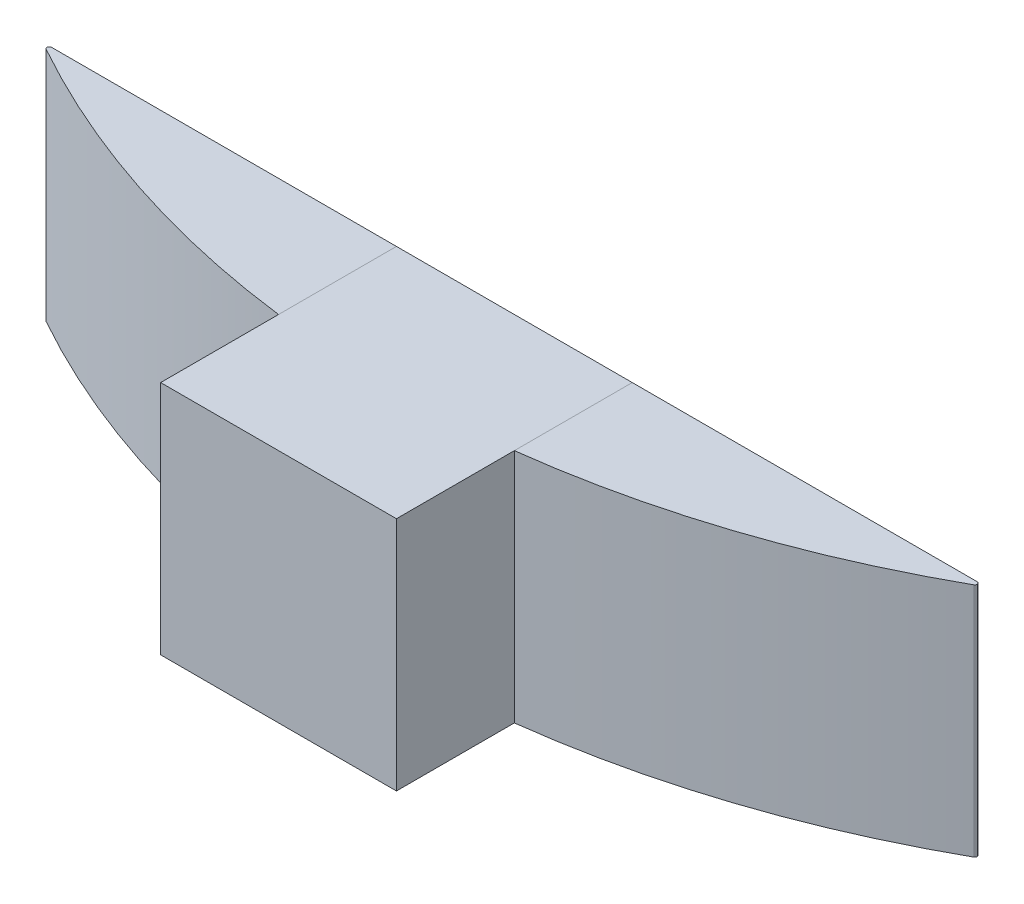
ISO-10303-21;
HEADER;
FILE_DESCRIPTION(('STEP AP214'),'2;1');
FILE_NAME('part.step','',(''),(''),'','','');
FILE_SCHEMA(('AUTOMOTIVE_DESIGN { 1 0 10303 214 1 1 1 1 }'));
ENDSEC;
DATA;
#1=APPLICATION_CONTEXT('core data for automotive mechanical design processes');
#2=APPLICATION_PROTOCOL_DEFINITION('international standard','automotive_design',2000,#1);
#3=PRODUCT_CONTEXT('',#1,'mechanical');
#4=PRODUCT('Part','Part','',(#3));
#5=PRODUCT_RELATED_PRODUCT_CATEGORY('part','',(#4));
#6=PRODUCT_DEFINITION_FORMATION('','',#4);
#7=PRODUCT_DEFINITION_CONTEXT('part definition',#1,'design');
#8=PRODUCT_DEFINITION('design','',#6,#7);
#9=PRODUCT_DEFINITION_SHAPE('','',#8);
#10=(LENGTH_UNIT() NAMED_UNIT(*) SI_UNIT(.MILLI.,.METRE.));
#11=(NAMED_UNIT(*) PLANE_ANGLE_UNIT() SI_UNIT($,.RADIAN.));
#12=(NAMED_UNIT(*) SI_UNIT($,.STERADIAN.) SOLID_ANGLE_UNIT());
#13=UNCERTAINTY_MEASURE_WITH_UNIT(LENGTH_MEASURE(1.E-05),#10,'distance_accuracy_value','');
#14=(GEOMETRIC_REPRESENTATION_CONTEXT(3) GLOBAL_UNCERTAINTY_ASSIGNED_CONTEXT((#13)) GLOBAL_UNIT_ASSIGNED_CONTEXT((#10,
#11,#12)) REPRESENTATION_CONTEXT('',''));
#15=CARTESIAN_POINT('',(0.,0.,0.));
#16=DIRECTION('',(0.,0.,1.));
#17=DIRECTION('',(1.,0.,0.));
#18=AXIS2_PLACEMENT_3D('',#15,#16,#17);
#19=CARTESIAN_POINT('',(0.,0.,0.));
#20=DIRECTION('',(0.,0.,1.));
#21=DIRECTION('',(1.,0.,0.));
#22=AXIS2_PLACEMENT_3D('',#19,#20,#21);
#23=PLANE('',#22);
#24=DIRECTION('',(1.,0.,0.));
#25=VECTOR('',#24,1.);
#26=CARTESIAN_POINT('',(-0.5,0.5,0.));
#27=LINE('',#26,#25);
#28=CARTESIAN_POINT('',(-0.5,0.5,0.));
#29=VERTEX_POINT('',#28);
#30=CARTESIAN_POINT('',(0.5,0.5,0.));
#31=VERTEX_POINT('',#30);
#32=EDGE_CURVE('P0_E20',#29,#31,#27,.T.);
#33=ORIENTED_EDGE('',*,*,#32,.T.);
#34=DIRECTION('',(0.,-1.,0.));
#35=VECTOR('',#34,1.);
#36=CARTESIAN_POINT('',(0.5,0.5,0.));
#37=LINE('',#36,#35);
#38=CARTESIAN_POINT('',(0.5,-0.5,0.));
#39=VERTEX_POINT('',#38);
#40=EDGE_CURVE('P0_E71',#31,#39,#37,.T.);
#41=ORIENTED_EDGE('',*,*,#40,.T.);
#42=DIRECTION('',(-1.,0.,0.));
#43=VECTOR('',#42,1.);
#44=CARTESIAN_POINT('',(0.5,-0.5,0.));
#45=LINE('',#44,#43);
#46=CARTESIAN_POINT('',(-0.5,-0.5,0.));
#47=VERTEX_POINT('',#46);
#48=EDGE_CURVE('P0_E99',#39,#47,#45,.T.);
#49=ORIENTED_EDGE('',*,*,#48,.T.);
#50=DIRECTION('',(0.,1.,0.));
#51=VECTOR('',#50,1.);
#52=CARTESIAN_POINT('',(-0.5,-0.5,0.));
#53=LINE('',#52,#51);
#54=EDGE_CURVE('P0_E72',#47,#29,#53,.T.);
#55=ORIENTED_EDGE('',*,*,#54,.T.);
#56=EDGE_LOOP('',(#33,#41,#49,#55));
#57=FACE_BOUND('',#56,.T.);
#58=ADVANCED_FACE('P0_F17',(#57),#23,.F.);
#59=CARTESIAN_POINT('',(0.,0.,1.));
#60=DIRECTION('',(0.,0.,1.));
#61=DIRECTION('',(1.,0.,0.));
#62=AXIS2_PLACEMENT_3D('',#59,#60,#61);
#63=PLANE('',#62);
#64=DIRECTION('',(-1.,0.,0.));
#65=VECTOR('',#64,1.);
#66=CARTESIAN_POINT('',(-0.5,0.5,1.));
#67=LINE('',#66,#65);
#68=CARTESIAN_POINT('',(0.5,0.5,1.));
#69=VERTEX_POINT('',#68);
#70=CARTESIAN_POINT('',(-0.5,0.5,1.));
#71=VERTEX_POINT('',#70);
#72=EDGE_CURVE('P0_E11',#69,#71,#67,.T.);
#73=ORIENTED_EDGE('',*,*,#72,.T.);
#74=DIRECTION('',(0.,-1.,0.));
#75=VECTOR('',#74,1.);
#76=CARTESIAN_POINT('',(-0.5,-0.5,1.));
#77=LINE('',#76,#75);
#78=CARTESIAN_POINT('',(-0.5,-0.5,1.));
#79=VERTEX_POINT('',#78);
#80=EDGE_CURVE('P0_E100',#71,#79,#77,.T.);
#81=ORIENTED_EDGE('',*,*,#80,.T.);
#82=DIRECTION('',(1.,0.,0.));
#83=VECTOR('',#82,1.);
#84=CARTESIAN_POINT('',(0.5,-0.5,1.));
#85=LINE('',#84,#83);
#86=CARTESIAN_POINT('',(0.5,-0.5,1.));
#87=VERTEX_POINT('',#86);
#88=EDGE_CURVE('P0_E93',#79,#87,#85,.T.);
#89=ORIENTED_EDGE('',*,*,#88,.T.);
#90=DIRECTION('',(0.,1.,0.));
#91=VECTOR('',#90,1.);
#92=CARTESIAN_POINT('',(0.5,0.5,1.));
#93=LINE('',#92,#91);
#94=EDGE_CURVE('P0_E81',#87,#69,#93,.T.);
#95=ORIENTED_EDGE('',*,*,#94,.T.);
#96=EDGE_LOOP('',(#73,#81,#89,#95));
#97=FACE_BOUND('',#96,.T.);
#98=ADVANCED_FACE('P0_F118',(#97),#63,.T.);
#99=CARTESIAN_POINT('',(0.5,0.5,0.));
#100=DIRECTION('',(0.,1.,0.));
#101=DIRECTION('',(1.,0.,0.));
#102=AXIS2_PLACEMENT_3D('',#99,#100,#101);
#103=PLANE('',#102);
#104=ORIENTED_EDGE('',*,*,#32,.F.);
#105=DIRECTION('',(0.,0.,1.));
#106=VECTOR('',#105,1.);
#107=CARTESIAN_POINT('',(-0.5,0.5,0.));
#108=LINE('',#107,#106);
#109=EDGE_CURVE('P0_E74',#29,#71,#108,.T.);
#110=ORIENTED_EDGE('',*,*,#109,.T.);
#111=ORIENTED_EDGE('',*,*,#72,.F.);
#112=DIRECTION('',(0.,0.,1.));
#113=VECTOR('',#112,1.);
#114=CARTESIAN_POINT('',(0.5,0.5,0.));
#115=LINE('',#114,#113);
#116=EDGE_CURVE('P0_E76',#31,#69,#115,.T.);
#117=ORIENTED_EDGE('',*,*,#116,.F.);
#118=EDGE_LOOP('',(#104,#110,#111,#117));
#119=FACE_BOUND('',#118,.T.);
#120=ADVANCED_FACE('P0_F77',(#119),#103,.T.);
#121=CARTESIAN_POINT('',(-0.5,0.5,0.));
#122=DIRECTION('',(-1.,0.,0.));
#123=DIRECTION('',(0.,0.,1.));
#124=AXIS2_PLACEMENT_3D('',#121,#122,#123);
#125=PLANE('',#124);
#126=ORIENTED_EDGE('',*,*,#54,.F.);
#127=DIRECTION('',(0.,0.,1.));
#128=VECTOR('',#127,1.);
#129=CARTESIAN_POINT('',(-0.5,-0.5,0.));
#130=LINE('',#129,#128);
#131=EDGE_CURVE('P0_E105',#47,#79,#130,.T.);
#132=ORIENTED_EDGE('',*,*,#131,.T.);
#133=ORIENTED_EDGE('',*,*,#80,.F.);
#134=ORIENTED_EDGE('',*,*,#109,.F.);
#135=EDGE_LOOP('',(#126,#132,#133,#134));
#136=FACE_BOUND('',#135,.T.);
#137=ADVANCED_FACE('P0_F115',(#136),#125,.T.);
#138=CARTESIAN_POINT('',(-0.5,-0.5,0.));
#139=DIRECTION('',(0.,-1.,0.));
#140=DIRECTION('',(0.,0.,-1.));
#141=AXIS2_PLACEMENT_3D('',#138,#139,#140);
#142=PLANE('',#141);
#143=ORIENTED_EDGE('',*,*,#48,.F.);
#144=DIRECTION('',(0.,0.,1.));
#145=VECTOR('',#144,1.);
#146=CARTESIAN_POINT('',(0.5,-0.5,0.));
#147=LINE('',#146,#145);
#148=EDGE_CURVE('P0_E86',#39,#87,#147,.T.);
#149=ORIENTED_EDGE('',*,*,#148,.T.);
#150=ORIENTED_EDGE('',*,*,#88,.F.);
#151=ORIENTED_EDGE('',*,*,#131,.F.);
#152=EDGE_LOOP('',(#143,#149,#150,#151));
#153=FACE_BOUND('',#152,.T.);
#154=ADVANCED_FACE('P0_F121',(#153),#142,.T.);
#155=CARTESIAN_POINT('',(0.5,-0.5,0.));
#156=DIRECTION('',(1.,0.,0.));
#157=DIRECTION('',(0.,1.,0.));
#158=AXIS2_PLACEMENT_3D('',#155,#156,#157);
#159=PLANE('',#158);
#160=ORIENTED_EDGE('',*,*,#40,.F.);
#161=ORIENTED_EDGE('',*,*,#116,.T.);
#162=ORIENTED_EDGE('',*,*,#94,.F.);
#163=ORIENTED_EDGE('',*,*,#148,.F.);
#164=EDGE_LOOP('',(#160,#161,#162,#163));
#165=FACE_BOUND('',#164,.T.);
#166=ADVANCED_FACE('P0_F84',(#165),#159,.T.);
#167=CLOSED_SHELL('',(#58,#98,#120,#137,#154,#166));
#168=MANIFOLD_SOLID_BREP('P0_B1',#167);
#169=CARTESIAN_POINT('',(0.,0.5,0.25000000000062));
#170=DIRECTION('',(0.,1.,0.));
#171=DIRECTION('',(1.,0.,0.));
#172=AXIS2_PLACEMENT_3D('',#169,#170,#171);
#173=PLANE('',#172);
#174=CARTESIAN_POINT('',(-1.96198303318795,0.5,0.01));
#175=DIRECTION('',(0.,-1.,0.));
#176=DIRECTION('',(-0.967700679043247,0.,-0.252101955127757));
#177=AXIS2_PLACEMENT_3D('',#174,#175,#176);
#178=CIRCLE('',#177,0.01);
#179=CARTESIAN_POINT('',(-1.96686221785125,0.5,0.0187288920844153));
#180=VERTEX_POINT('',#179);
#181=CARTESIAN_POINT('',(-1.96198303318795,0.5,0.));
#182=VERTEX_POINT('',#181);
#183=EDGE_CURVE('P1_E82',#180,#182,#178,.T.);
#184=ORIENTED_EDGE('',*,*,#183,.F.);
#185=CARTESIAN_POINT('',(0.,0.5,-3.49999999999007));
#186=DIRECTION('',(0.,-1.,0.));
#187=DIRECTION('',(-0.124034734589512,0.,0.99227787671363));
#188=AXIS2_PLACEMENT_3D('',#185,#186,#187);
#189=CIRCLE('',#188,4.03112887414066);
#190=CARTESIAN_POINT('',(-0.500000000000154,0.5,0.500000000001222));
#191=VERTEX_POINT('',#190);
#192=EDGE_CURVE('P1_E27',#191,#180,#189,.T.);
#193=ORIENTED_EDGE('',*,*,#192,.F.);
#194=DIRECTION('',(0.,0.,1.));
#195=VECTOR('',#194,1.);
#196=CARTESIAN_POINT('',(-0.5,0.5,0.375000000000921));
#197=LINE('',#196,#195);
#198=CARTESIAN_POINT('',(-0.5,0.5,0.));
#199=VERTEX_POINT('',#198);
#200=EDGE_CURVE('P1_E11',#199,#191,#197,.T.);
#201=ORIENTED_EDGE('',*,*,#200,.F.);
#202=DIRECTION('',(1.,0.,0.));
#203=VECTOR('',#202,1.);
#204=CARTESIAN_POINT('',(-0.25,0.5,0.));
#205=LINE('',#204,#203);
#206=EDGE_CURVE('P1_E89',#182,#199,#205,.T.);
#207=ORIENTED_EDGE('',*,*,#206,.F.);
#208=EDGE_LOOP('',(#184,#193,#201,#207));
#209=FACE_BOUND('',#208,.T.);
#210=ADVANCED_FACE('P1_F17',(#209),#173,.T.);
#211=CARTESIAN_POINT('',(-0.5,-0.5,0.500000000001222));
#212=DIRECTION('',(1.,0.,0.));
#213=DIRECTION('',(0.,1.,0.));
#214=AXIS2_PLACEMENT_3D('',#211,#212,#213);
#215=PLANE('',#214);
#216=ORIENTED_EDGE('',*,*,#200,.T.);
#217=DIRECTION('',(0.,1.,0.));
#218=VECTOR('',#217,1.);
#219=CARTESIAN_POINT('',(-0.500000000000154,-0.5,0.500000000001222));
#220=LINE('',#219,#218);
#221=CARTESIAN_POINT('',(-0.500000000000154,-0.5,0.500000000001222));
#222=VERTEX_POINT('',#221);
#223=EDGE_CURVE('P1_E21',#222,#191,#220,.T.);
#224=ORIENTED_EDGE('',*,*,#223,.F.);
#225=DIRECTION('',(0.,0.,-1.));
#226=VECTOR('',#225,1.);
#227=CARTESIAN_POINT('',(-0.5,-0.5,1.));
#228=LINE('',#227,#226);
#229=CARTESIAN_POINT('',(-0.5,-0.5,0.));
#230=VERTEX_POINT('',#229);
#231=EDGE_CURVE('P1_E107',#222,#230,#228,.T.);
#232=ORIENTED_EDGE('',*,*,#231,.T.);
#233=DIRECTION('',(0.,1.,0.));
#234=VECTOR('',#233,1.);
#235=CARTESIAN_POINT('',(-0.5,-0.5,0.));
#236=LINE('',#235,#234);
#237=EDGE_CURVE('P1_E100',#230,#199,#236,.T.);
#238=ORIENTED_EDGE('',*,*,#237,.T.);
#239=EDGE_LOOP('',(#216,#224,#232,#238));
#240=FACE_BOUND('',#239,.T.);
#241=ADVANCED_FACE('P1_F19',(#240),#215,.T.);
#242=CARTESIAN_POINT('',(0.,-0.5,-3.49999999999007));
#243=DIRECTION('',(0.,1.,0.));
#244=DIRECTION('',(-0.124034734589512,0.,0.99227787671363));
#245=AXIS2_PLACEMENT_3D('',#242,#243,#244);
#246=CYLINDRICAL_SURFACE('',#245,4.03112887414066);
#247=DIRECTION('',(0.,1.,0.));
#248=VECTOR('',#247,1.);
#249=CARTESIAN_POINT('',(-1.96686221785125,-0.5,0.0187288920844153));
#250=LINE('',#249,#248);
#251=CARTESIAN_POINT('',(-1.96686221785125,-0.5,0.0187288920844153));
#252=VERTEX_POINT('',#251);
#253=EDGE_CURVE('P1_E73',#252,#180,#250,.T.);
#254=ORIENTED_EDGE('',*,*,#253,.F.);
#255=CARTESIAN_POINT('',(0.,-0.5,-3.49999999999007));
#256=DIRECTION('',(0.,-1.,0.));
#257=DIRECTION('',(-0.124034734589512,0.,0.99227787671363));
#258=AXIS2_PLACEMENT_3D('',#255,#256,#257);
#259=CIRCLE('',#258,4.03112887414066);
#260=EDGE_CURVE('P1_E111',#222,#252,#259,.T.);
#261=ORIENTED_EDGE('',*,*,#260,.F.);
#262=ORIENTED_EDGE('',*,*,#223,.T.);
#263=ORIENTED_EDGE('',*,*,#192,.T.);
#264=EDGE_LOOP('',(#254,#261,#262,#263));
#265=FACE_BOUND('',#264,.T.);
#266=ADVANCED_FACE('P1_F71',(#265),#246,.T.);
#267=CARTESIAN_POINT('',(-0.5,-0.5,0.));
#268=DIRECTION('',(0.,0.,-1.));
#269=DIRECTION('',(0.,-1.,0.));
#270=AXIS2_PLACEMENT_3D('',#267,#268,#269);
#271=PLANE('',#270);
#272=DIRECTION('',(0.,-1.,0.));
#273=VECTOR('',#272,1.);
#274=CARTESIAN_POINT('',(-1.96198303318795,-0.5,0.));
#275=LINE('',#274,#273);
#276=CARTESIAN_POINT('',(-1.96198303318795,-0.5,0.));
#277=VERTEX_POINT('',#276);
#278=EDGE_CURVE('P1_E92',#182,#277,#275,.T.);
#279=ORIENTED_EDGE('',*,*,#278,.F.);
#280=ORIENTED_EDGE('',*,*,#206,.T.);
#281=ORIENTED_EDGE('',*,*,#237,.F.);
#282=DIRECTION('',(1.,0.,0.));
#283=VECTOR('',#282,1.);
#284=CARTESIAN_POINT('',(-2.,-0.5,0.));
#285=LINE('',#284,#283);
#286=EDGE_CURVE('P1_E86',#277,#230,#285,.T.);
#287=ORIENTED_EDGE('',*,*,#286,.F.);
#288=EDGE_LOOP('',(#279,#280,#281,#287));
#289=FACE_BOUND('',#288,.T.);
#290=ADVANCED_FACE('P1_F150',(#289),#271,.T.);
#291=CARTESIAN_POINT('',(-1.25,-0.5,0.250000000000611));
#292=DIRECTION('',(0.,-1.,0.));
#293=DIRECTION('',(0.,0.,-1.));
#294=AXIS2_PLACEMENT_3D('',#291,#292,#293);
#295=PLANE('',#294);
#296=CARTESIAN_POINT('',(-1.96198303318795,-0.5,0.01));
#297=DIRECTION('',(0.,1.,0.));
#298=DIRECTION('',(-0.967700679043247,0.,-0.252101955127757));
#299=AXIS2_PLACEMENT_3D('',#296,#297,#298);
#300=CIRCLE('',#299,0.01);
#301=EDGE_CURVE('P1_E84',#277,#252,#300,.T.);
#302=ORIENTED_EDGE('',*,*,#301,.F.);
#303=ORIENTED_EDGE('',*,*,#286,.T.);
#304=ORIENTED_EDGE('',*,*,#231,.F.);
#305=ORIENTED_EDGE('',*,*,#260,.T.);
#306=EDGE_LOOP('',(#302,#303,#304,#305));
#307=FACE_BOUND('',#306,.T.);
#308=ADVANCED_FACE('P1_F139',(#307),#295,.T.);
#309=CARTESIAN_POINT('',(-1.96198303318795,-0.5,0.01));
#310=DIRECTION('',(0.,1.,0.));
#311=DIRECTION('',(-0.967700679043248,0.,-0.252101955127758));
#312=AXIS2_PLACEMENT_3D('',#309,#310,#311);
#313=CYLINDRICAL_SURFACE('',#312,0.01);
#314=ORIENTED_EDGE('',*,*,#183,.T.);
#315=ORIENTED_EDGE('',*,*,#278,.T.);
#316=ORIENTED_EDGE('',*,*,#301,.T.);
#317=ORIENTED_EDGE('',*,*,#253,.T.);
#318=EDGE_LOOP('',(#314,#315,#316,#317));
#319=FACE_BOUND('',#318,.T.);
#320=ADVANCED_FACE('P1_F80',(#319),#313,.T.);
#321=CLOSED_SHELL('',(#210,#241,#266,#290,#308,#320));
#322=MANIFOLD_SOLID_BREP('P1_B1',#321);
#323=CARTESIAN_POINT('',(0.,0.5,0.25000000000062));
#324=DIRECTION('',(0.,1.,0.));
#325=DIRECTION('',(1.,0.,0.));
#326=AXIS2_PLACEMENT_3D('',#323,#324,#325);
#327=PLANE('',#326);
#328=CARTESIAN_POINT('',(1.96198303318795,0.5,0.0100000000000006));
#329=DIRECTION('',(0.,-1.,0.));
#330=DIRECTION('',(0.967700679043214,0.,-0.252101955127887));
#331=AXIS2_PLACEMENT_3D('',#328,#329,#330);
#332=CIRCLE('',#331,0.01);
#333=CARTESIAN_POINT('',(1.96198303318795,0.5,0.));
#334=VERTEX_POINT('',#333);
#335=CARTESIAN_POINT('',(1.96686221785125,0.5,0.0187288920844164));
#336=VERTEX_POINT('',#335);
#337=EDGE_CURVE('P2_E82',#334,#336,#332,.T.);
#338=ORIENTED_EDGE('',*,*,#337,.F.);
#339=DIRECTION('',(1.,0.,0.));
#340=VECTOR('',#339,1.);
#341=CARTESIAN_POINT('',(1.,0.5,0.));
#342=LINE('',#341,#340);
#343=CARTESIAN_POINT('',(0.5,0.5,0.));
#344=VERTEX_POINT('',#343);
#345=EDGE_CURVE('P2_E27',#344,#334,#342,.T.);
#346=ORIENTED_EDGE('',*,*,#345,.F.);
#347=DIRECTION('',(0.,0.,-1.));
#348=VECTOR('',#347,1.);
#349=CARTESIAN_POINT('',(0.5,0.5,0.12500000000031));
#350=LINE('',#349,#348);
#351=CARTESIAN_POINT('',(0.5,0.5,0.500000000001241));
#352=VERTEX_POINT('',#351);
#353=EDGE_CURVE('P2_E11',#352,#344,#350,.T.);
#354=ORIENTED_EDGE('',*,*,#353,.F.);
#355=CARTESIAN_POINT('',(0.,0.5,-3.49999999999007));
#356=DIRECTION('',(0.,-1.,0.));
#357=DIRECTION('',(0.496138938357895,0.,0.868243142123853));
#358=AXIS2_PLACEMENT_3D('',#355,#356,#357);
#359=CIRCLE('',#358,4.03112887414066);
#360=EDGE_CURVE('P2_E89',#336,#352,#359,.T.);
#361=ORIENTED_EDGE('',*,*,#360,.F.);
#362=EDGE_LOOP('',(#338,#346,#354,#361));
#363=FACE_BOUND('',#362,.T.);
#364=ADVANCED_FACE('P2_F17',(#363),#327,.T.);
#365=CARTESIAN_POINT('',(0.5,-0.5,0.));
#366=DIRECTION('',(-1.,0.,0.));
#367=DIRECTION('',(0.,0.,1.));
#368=AXIS2_PLACEMENT_3D('',#365,#366,#367);
#369=PLANE('',#368);
#370=ORIENTED_EDGE('',*,*,#353,.T.);
#371=DIRECTION('',(0.,1.,0.));
#372=VECTOR('',#371,1.);
#373=CARTESIAN_POINT('',(0.5,-0.5,0.));
#374=LINE('',#373,#372);
#375=CARTESIAN_POINT('',(0.5,-0.5,0.));
#376=VERTEX_POINT('',#375);
#377=EDGE_CURVE('P2_E21',#376,#344,#374,.T.);
#378=ORIENTED_EDGE('',*,*,#377,.F.);
#379=DIRECTION('',(0.,0.,1.));
#380=VECTOR('',#379,1.);
#381=CARTESIAN_POINT('',(0.5,-0.5,0.));
#382=LINE('',#381,#380);
#383=CARTESIAN_POINT('',(0.5,-0.5,0.500000000001241));
#384=VERTEX_POINT('',#383);
#385=EDGE_CURVE('P2_E103',#376,#384,#382,.T.);
#386=ORIENTED_EDGE('',*,*,#385,.T.);
#387=DIRECTION('',(0.,1.,0.));
#388=VECTOR('',#387,1.);
#389=CARTESIAN_POINT('',(0.5,-0.5,0.500000000001241));
#390=LINE('',#389,#388);
#391=EDGE_CURVE('P2_E107',#384,#352,#390,.T.);
#392=ORIENTED_EDGE('',*,*,#391,.T.);
#393=EDGE_LOOP('',(#370,#378,#386,#392));
#394=FACE_BOUND('',#393,.T.);
#395=ADVANCED_FACE('P2_F167',(#394),#369,.T.);
#396=CARTESIAN_POINT('',(2.,-0.5,0.));
#397=DIRECTION('',(0.,0.,-1.));
#398=DIRECTION('',(0.,-1.,0.));
#399=AXIS2_PLACEMENT_3D('',#396,#397,#398);
#400=PLANE('',#399);
#401=DIRECTION('',(0.,1.,0.));
#402=VECTOR('',#401,1.);
#403=CARTESIAN_POINT('',(1.96198303318795,-0.5,0.));
#404=LINE('',#403,#402);
#405=CARTESIAN_POINT('',(1.96198303318795,-0.5,0.));
#406=VERTEX_POINT('',#405);
#407=EDGE_CURVE('P2_E73',#406,#334,#404,.T.);
#408=ORIENTED_EDGE('',*,*,#407,.F.);
#409=DIRECTION('',(1.,0.,0.));
#410=VECTOR('',#409,1.);
#411=CARTESIAN_POINT('',(0.5,-0.5,0.));
#412=LINE('',#411,#410);
#413=EDGE_CURVE('P2_E108',#376,#406,#412,.T.);
#414=ORIENTED_EDGE('',*,*,#413,.F.);
#415=ORIENTED_EDGE('',*,*,#377,.T.);
#416=ORIENTED_EDGE('',*,*,#345,.T.);
#417=EDGE_LOOP('',(#408,#414,#415,#416));
#418=FACE_BOUND('',#417,.T.);
#419=ADVANCED_FACE('P2_F71',(#418),#400,.T.);
#420=CARTESIAN_POINT('',(0.,-0.5,-3.49999999999007));
#421=DIRECTION('',(0.,1.,0.));
#422=DIRECTION('',(0.496138938357895,0.,0.868243142123853));
#423=AXIS2_PLACEMENT_3D('',#420,#421,#422);
#424=CYLINDRICAL_SURFACE('',#423,4.03112887414066);
#425=DIRECTION('',(0.,-1.,0.));
#426=VECTOR('',#425,1.);
#427=CARTESIAN_POINT('',(1.96686221785125,-0.5,0.0187288920844159));
#428=LINE('',#427,#426);
#429=CARTESIAN_POINT('',(1.96686221785125,-0.5,0.0187288920844164));
#430=VERTEX_POINT('',#429);
#431=EDGE_CURVE('P2_E92',#336,#430,#428,.T.);
#432=ORIENTED_EDGE('',*,*,#431,.F.);
#433=ORIENTED_EDGE('',*,*,#360,.T.);
#434=ORIENTED_EDGE('',*,*,#391,.F.);
#435=CARTESIAN_POINT('',(0.,-0.5,-3.49999999999007));
#436=DIRECTION('',(0.,-1.,0.));
#437=DIRECTION('',(0.496138938357895,0.,0.868243142123853));
#438=AXIS2_PLACEMENT_3D('',#435,#436,#437);
#439=CIRCLE('',#438,4.03112887414066);
#440=EDGE_CURVE('P2_E86',#430,#384,#439,.T.);
#441=ORIENTED_EDGE('',*,*,#440,.F.);
#442=EDGE_LOOP('',(#432,#433,#434,#441));
#443=FACE_BOUND('',#442,.T.);
#444=ADVANCED_FACE('P2_F19',(#443),#424,.T.);
#445=CARTESIAN_POINT('',(1.25,-0.5,0.25000000000062));
#446=DIRECTION('',(0.,-1.,0.));
#447=DIRECTION('',(0.,0.,-1.));
#448=AXIS2_PLACEMENT_3D('',#445,#446,#447);
#449=PLANE('',#448);
#450=CARTESIAN_POINT('',(1.96198303318795,-0.5,0.0100000000000006));
#451=DIRECTION('',(0.,1.,0.));
#452=DIRECTION('',(0.967700679043214,0.,-0.252101955127887));
#453=AXIS2_PLACEMENT_3D('',#450,#451,#452);
#454=CIRCLE('',#453,0.01);
#455=EDGE_CURVE('P2_E84',#430,#406,#454,.T.);
#456=ORIENTED_EDGE('',*,*,#455,.F.);
#457=ORIENTED_EDGE('',*,*,#440,.T.);
#458=ORIENTED_EDGE('',*,*,#385,.F.);
#459=ORIENTED_EDGE('',*,*,#413,.T.);
#460=EDGE_LOOP('',(#456,#457,#458,#459));
#461=FACE_BOUND('',#460,.T.);
#462=ADVANCED_FACE('P2_F137',(#461),#449,.T.);
#463=CARTESIAN_POINT('',(1.96198303318795,-0.5,0.0100000000000006));
#464=DIRECTION('',(0.,1.,0.));
#465=DIRECTION('',(0.967700679043214,0.,-0.252101955127887));
#466=AXIS2_PLACEMENT_3D('',#463,#464,#465);
#467=CYLINDRICAL_SURFACE('',#466,0.01);
#468=ORIENTED_EDGE('',*,*,#337,.T.);
#469=ORIENTED_EDGE('',*,*,#431,.T.);
#470=ORIENTED_EDGE('',*,*,#455,.T.);
#471=ORIENTED_EDGE('',*,*,#407,.T.);
#472=EDGE_LOOP('',(#468,#469,#470,#471));
#473=FACE_BOUND('',#472,.T.);
#474=ADVANCED_FACE('P2_F80',(#473),#467,.T.);
#475=CLOSED_SHELL('',(#364,#395,#419,#444,#462,#474));
#476=MANIFOLD_SOLID_BREP('P2_B1',#475);
#477=ADVANCED_BREP_SHAPE_REPRESENTATION('',(#18,#168,#322,#476),#14);
#478=SHAPE_DEFINITION_REPRESENTATION(#9,#477);
ENDSEC;
END-ISO-10303-21;
